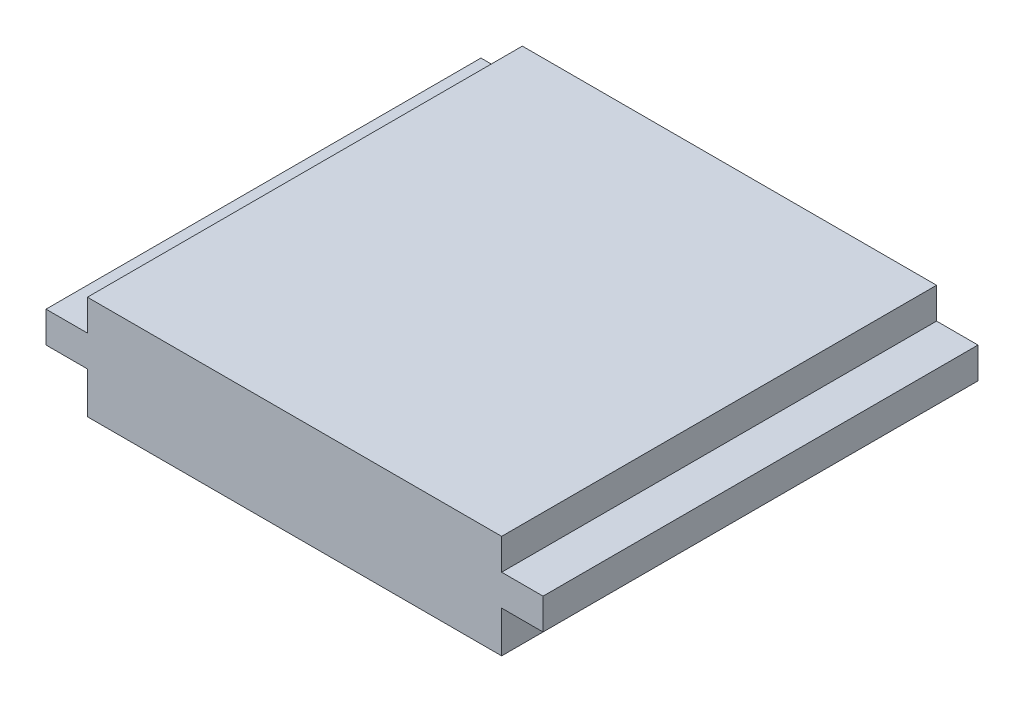
ISO-10303-21;
HEADER;
FILE_DESCRIPTION(('STEP AP214'),'2;1');
FILE_NAME('part.step','',(''),(''),'','','');
FILE_SCHEMA(('AUTOMOTIVE_DESIGN { 1 0 10303 214 1 1 1 1 }'));
ENDSEC;
DATA;
#1=APPLICATION_CONTEXT('core data for automotive mechanical design processes');
#2=APPLICATION_PROTOCOL_DEFINITION('international standard','automotive_design',2000,#1);
#3=PRODUCT_CONTEXT('',#1,'mechanical');
#4=PRODUCT('Part','Part','',(#3));
#5=PRODUCT_RELATED_PRODUCT_CATEGORY('part','',(#4));
#6=PRODUCT_DEFINITION_FORMATION('','',#4);
#7=PRODUCT_DEFINITION_CONTEXT('part definition',#1,'design');
#8=PRODUCT_DEFINITION('design','',#6,#7);
#9=PRODUCT_DEFINITION_SHAPE('','',#8);
#10=(LENGTH_UNIT() NAMED_UNIT(*) SI_UNIT(.MILLI.,.METRE.));
#11=(NAMED_UNIT(*) PLANE_ANGLE_UNIT() SI_UNIT($,.RADIAN.));
#12=(NAMED_UNIT(*) SI_UNIT($,.STERADIAN.) SOLID_ANGLE_UNIT());
#13=UNCERTAINTY_MEASURE_WITH_UNIT(LENGTH_MEASURE(1.E-05),#10,'distance_accuracy_value','');
#14=(GEOMETRIC_REPRESENTATION_CONTEXT(3) GLOBAL_UNCERTAINTY_ASSIGNED_CONTEXT((#13)) GLOBAL_UNIT_ASSIGNED_CONTEXT((#10,
#11,#12)) REPRESENTATION_CONTEXT('',''));
#15=CARTESIAN_POINT('',(0.,0.,0.));
#16=DIRECTION('',(0.,0.,1.));
#17=DIRECTION('',(1.,0.,0.));
#18=AXIS2_PLACEMENT_3D('',#15,#16,#17);
#19=CARTESIAN_POINT('',(0.,2.,21.));
#20=DIRECTION('',(1.,0.,0.));
#21=DIRECTION('',(0.,1.,0.));
#22=AXIS2_PLACEMENT_3D('',#19,#20,#21);
#23=PLANE('',#22);
#24=DIRECTION('',(0.,-1.,0.));
#25=VECTOR('',#24,1.);
#26=CARTESIAN_POINT('',(0.,2.,0.));
#27=LINE('',#26,#25);
#28=CARTESIAN_POINT('',(0.,2.,0.));
#29=VERTEX_POINT('',#28);
#30=CARTESIAN_POINT('',(0.,0.,0.));
#31=VERTEX_POINT('',#30);
#32=EDGE_CURVE('E156',#29,#31,#27,.T.);
#33=ORIENTED_EDGE('',*,*,#32,.T.);
#34=DIRECTION('',(0.,0.,-1.));
#35=VECTOR('',#34,1.);
#36=CARTESIAN_POINT('',(0.,0.,21.));
#37=LINE('',#36,#35);
#38=CARTESIAN_POINT('',(0.,0.,21.));
#39=VERTEX_POINT('',#38);
#40=EDGE_CURVE('E11',#39,#31,#37,.T.);
#41=ORIENTED_EDGE('',*,*,#40,.F.);
#42=DIRECTION('',(0.,-1.,0.));
#43=VECTOR('',#42,1.);
#44=CARTESIAN_POINT('',(0.,2.,21.));
#45=LINE('',#44,#43);
#46=CARTESIAN_POINT('',(0.,2.,21.));
#47=VERTEX_POINT('',#46);
#48=EDGE_CURVE('E178',#47,#39,#45,.T.);
#49=ORIENTED_EDGE('',*,*,#48,.F.);
#50=DIRECTION('',(0.,0.,-1.));
#51=VECTOR('',#50,1.);
#52=CARTESIAN_POINT('',(0.,2.,21.));
#53=LINE('',#52,#51);
#54=EDGE_CURVE('E152',#47,#29,#53,.T.);
#55=ORIENTED_EDGE('',*,*,#54,.T.);
#56=EDGE_LOOP('',(#33,#41,#49,#55));
#57=FACE_BOUND('',#56,.T.);
#58=ADVANCED_FACE('F36',(#57),#23,.F.);
#59=CARTESIAN_POINT('',(0.,0.,21.));
#60=DIRECTION('',(0.,1.,0.));
#61=DIRECTION('',(0.,0.,1.));
#62=AXIS2_PLACEMENT_3D('',#59,#60,#61);
#63=PLANE('',#62);
#64=DIRECTION('',(1.,0.,0.));
#65=VECTOR('',#64,1.);
#66=CARTESIAN_POINT('',(0.,0.,0.));
#67=LINE('',#66,#65);
#68=CARTESIAN_POINT('',(20.,0.,0.));
#69=VERTEX_POINT('',#68);
#70=EDGE_CURVE('E159',#31,#69,#67,.T.);
#71=ORIENTED_EDGE('',*,*,#70,.T.);
#72=DIRECTION('',(0.,0.,-1.));
#73=VECTOR('',#72,1.);
#74=CARTESIAN_POINT('',(20.,0.,21.));
#75=LINE('',#74,#73);
#76=CARTESIAN_POINT('',(20.,0.,21.));
#77=VERTEX_POINT('',#76);
#78=EDGE_CURVE('E44',#77,#69,#75,.T.);
#79=ORIENTED_EDGE('',*,*,#78,.F.);
#80=DIRECTION('',(1.,0.,0.));
#81=VECTOR('',#80,1.);
#82=CARTESIAN_POINT('',(0.,0.,21.));
#83=LINE('',#82,#81);
#84=EDGE_CURVE('E107',#39,#77,#83,.T.);
#85=ORIENTED_EDGE('',*,*,#84,.F.);
#86=ORIENTED_EDGE('',*,*,#40,.T.);
#87=EDGE_LOOP('',(#71,#79,#85,#86));
#88=FACE_BOUND('',#87,.T.);
#89=ADVANCED_FACE('F256',(#88),#63,.F.);
#90=CARTESIAN_POINT('',(20.,0.,21.));
#91=DIRECTION('',(-1.,0.,0.));
#92=DIRECTION('',(0.,0.,1.));
#93=AXIS2_PLACEMENT_3D('',#90,#91,#92);
#94=PLANE('',#93);
#95=DIRECTION('',(0.,1.,0.));
#96=VECTOR('',#95,1.);
#97=CARTESIAN_POINT('',(20.,0.,0.));
#98=LINE('',#97,#96);
#99=CARTESIAN_POINT('',(20.,2.,0.));
#100=VERTEX_POINT('',#99);
#101=EDGE_CURVE('E161',#69,#100,#98,.T.);
#102=ORIENTED_EDGE('',*,*,#101,.T.);
#103=DIRECTION('',(0.,0.,-1.));
#104=VECTOR('',#103,1.);
#105=CARTESIAN_POINT('',(20.,2.,21.));
#106=LINE('',#105,#104);
#107=CARTESIAN_POINT('',(20.,2.,21.));
#108=VERTEX_POINT('',#107);
#109=EDGE_CURVE('E197',#108,#100,#106,.T.);
#110=ORIENTED_EDGE('',*,*,#109,.F.);
#111=DIRECTION('',(0.,1.,0.));
#112=VECTOR('',#111,1.);
#113=CARTESIAN_POINT('',(20.,0.,21.));
#114=LINE('',#113,#112);
#115=EDGE_CURVE('E205',#77,#108,#114,.T.);
#116=ORIENTED_EDGE('',*,*,#115,.F.);
#117=ORIENTED_EDGE('',*,*,#78,.T.);
#118=EDGE_LOOP('',(#102,#110,#116,#117));
#119=FACE_BOUND('',#118,.T.);
#120=ADVANCED_FACE('F203',(#119),#94,.F.);
#121=CARTESIAN_POINT('',(20.,2.,21.));
#122=DIRECTION('',(0.,1.,0.));
#123=DIRECTION('',(0.,0.,1.));
#124=AXIS2_PLACEMENT_3D('',#121,#122,#123);
#125=PLANE('',#124);
#126=DIRECTION('',(1.,0.,0.));
#127=VECTOR('',#126,1.);
#128=CARTESIAN_POINT('',(20.,2.,0.));
#129=LINE('',#128,#127);
#130=CARTESIAN_POINT('',(22.,2.,0.));
#131=VERTEX_POINT('',#130);
#132=EDGE_CURVE('E163',#100,#131,#129,.T.);
#133=ORIENTED_EDGE('',*,*,#132,.T.);
#134=DIRECTION('',(0.,0.,-1.));
#135=VECTOR('',#134,1.);
#136=CARTESIAN_POINT('',(22.,2.,21.));
#137=LINE('',#136,#135);
#138=CARTESIAN_POINT('',(22.,2.,21.));
#139=VERTEX_POINT('',#138);
#140=EDGE_CURVE('E194',#139,#131,#137,.T.);
#141=ORIENTED_EDGE('',*,*,#140,.F.);
#142=DIRECTION('',(1.,0.,0.));
#143=VECTOR('',#142,1.);
#144=CARTESIAN_POINT('',(20.,2.,21.));
#145=LINE('',#144,#143);
#146=EDGE_CURVE('E223',#108,#139,#145,.T.);
#147=ORIENTED_EDGE('',*,*,#146,.F.);
#148=ORIENTED_EDGE('',*,*,#109,.T.);
#149=EDGE_LOOP('',(#133,#141,#147,#148));
#150=FACE_BOUND('',#149,.T.);
#151=ADVANCED_FACE('F214',(#150),#125,.F.);
#152=CARTESIAN_POINT('',(22.,2.,21.));
#153=DIRECTION('',(-1.,0.,0.));
#154=DIRECTION('',(0.,0.,1.));
#155=AXIS2_PLACEMENT_3D('',#152,#153,#154);
#156=PLANE('',#155);
#157=DIRECTION('',(0.,1.,0.));
#158=VECTOR('',#157,1.);
#159=CARTESIAN_POINT('',(22.,2.,0.));
#160=LINE('',#159,#158);
#161=CARTESIAN_POINT('',(22.,3.5,0.));
#162=VERTEX_POINT('',#161);
#163=EDGE_CURVE('E165',#131,#162,#160,.T.);
#164=ORIENTED_EDGE('',*,*,#163,.T.);
#165=DIRECTION('',(0.,0.,-1.));
#166=VECTOR('',#165,1.);
#167=CARTESIAN_POINT('',(22.,3.5,21.));
#168=LINE('',#167,#166);
#169=CARTESIAN_POINT('',(22.,3.5,21.));
#170=VERTEX_POINT('',#169);
#171=EDGE_CURVE('E191',#170,#162,#168,.T.);
#172=ORIENTED_EDGE('',*,*,#171,.F.);
#173=DIRECTION('',(0.,1.,0.));
#174=VECTOR('',#173,1.);
#175=CARTESIAN_POINT('',(22.,2.,21.));
#176=LINE('',#175,#174);
#177=EDGE_CURVE('E220',#139,#170,#176,.T.);
#178=ORIENTED_EDGE('',*,*,#177,.F.);
#179=ORIENTED_EDGE('',*,*,#140,.T.);
#180=EDGE_LOOP('',(#164,#172,#178,#179));
#181=FACE_BOUND('',#180,.T.);
#182=ADVANCED_FACE('F218',(#181),#156,.F.);
#183=CARTESIAN_POINT('',(22.,3.5,21.));
#184=DIRECTION('',(0.,-1.,0.));
#185=DIRECTION('',(1.,0.,0.));
#186=AXIS2_PLACEMENT_3D('',#183,#184,#185);
#187=PLANE('',#186);
#188=DIRECTION('',(-1.,0.,0.));
#189=VECTOR('',#188,1.);
#190=CARTESIAN_POINT('',(22.,3.5,0.));
#191=LINE('',#190,#189);
#192=CARTESIAN_POINT('',(20.,3.5,0.));
#193=VERTEX_POINT('',#192);
#194=EDGE_CURVE('E167',#162,#193,#191,.T.);
#195=ORIENTED_EDGE('',*,*,#194,.T.);
#196=DIRECTION('',(0.,0.,-1.));
#197=VECTOR('',#196,1.);
#198=CARTESIAN_POINT('',(20.,3.5,21.));
#199=LINE('',#198,#197);
#200=CARTESIAN_POINT('',(20.,3.5,21.));
#201=VERTEX_POINT('',#200);
#202=EDGE_CURVE('E188',#201,#193,#199,.T.);
#203=ORIENTED_EDGE('',*,*,#202,.F.);
#204=DIRECTION('',(-1.,0.,0.));
#205=VECTOR('',#204,1.);
#206=CARTESIAN_POINT('',(22.,3.5,21.));
#207=LINE('',#206,#205);
#208=EDGE_CURVE('E222',#170,#201,#207,.T.);
#209=ORIENTED_EDGE('',*,*,#208,.F.);
#210=ORIENTED_EDGE('',*,*,#171,.T.);
#211=EDGE_LOOP('',(#195,#203,#209,#210));
#212=FACE_BOUND('',#211,.T.);
#213=ADVANCED_FACE('F269',(#212),#187,.F.);
#214=CARTESIAN_POINT('',(20.,3.5,21.));
#215=DIRECTION('',(-1.,0.,0.));
#216=DIRECTION('',(0.,0.,1.));
#217=AXIS2_PLACEMENT_3D('',#214,#215,#216);
#218=PLANE('',#217);
#219=DIRECTION('',(0.,1.,0.));
#220=VECTOR('',#219,1.);
#221=CARTESIAN_POINT('',(20.,3.5,0.));
#222=LINE('',#221,#220);
#223=CARTESIAN_POINT('',(20.,5.,0.));
#224=VERTEX_POINT('',#223);
#225=EDGE_CURVE('E169',#193,#224,#222,.T.);
#226=ORIENTED_EDGE('',*,*,#225,.T.);
#227=DIRECTION('',(0.,0.,-1.));
#228=VECTOR('',#227,1.);
#229=CARTESIAN_POINT('',(20.,5.,21.));
#230=LINE('',#229,#228);
#231=CARTESIAN_POINT('',(20.,5.,21.));
#232=VERTEX_POINT('',#231);
#233=EDGE_CURVE('E185',#232,#224,#230,.T.);
#234=ORIENTED_EDGE('',*,*,#233,.F.);
#235=DIRECTION('',(0.,1.,0.));
#236=VECTOR('',#235,1.);
#237=CARTESIAN_POINT('',(20.,3.5,21.));
#238=LINE('',#237,#236);
#239=EDGE_CURVE('E225',#201,#232,#238,.T.);
#240=ORIENTED_EDGE('',*,*,#239,.F.);
#241=ORIENTED_EDGE('',*,*,#202,.T.);
#242=EDGE_LOOP('',(#226,#234,#240,#241));
#243=FACE_BOUND('',#242,.T.);
#244=ADVANCED_FACE('F272',(#243),#218,.F.);
#245=CARTESIAN_POINT('',(20.,5.,21.));
#246=DIRECTION('',(0.,-1.,0.));
#247=DIRECTION('',(1.,0.,0.));
#248=AXIS2_PLACEMENT_3D('',#245,#246,#247);
#249=PLANE('',#248);
#250=DIRECTION('',(-1.,0.,0.));
#251=VECTOR('',#250,1.);
#252=CARTESIAN_POINT('',(20.,5.,0.));
#253=LINE('',#252,#251);
#254=CARTESIAN_POINT('',(0.,5.,0.));
#255=VERTEX_POINT('',#254);
#256=EDGE_CURVE('E171',#224,#255,#253,.T.);
#257=ORIENTED_EDGE('',*,*,#256,.T.);
#258=DIRECTION('',(0.,0.,-1.));
#259=VECTOR('',#258,1.);
#260=CARTESIAN_POINT('',(0.,5.,21.));
#261=LINE('',#260,#259);
#262=CARTESIAN_POINT('',(0.,5.,21.));
#263=VERTEX_POINT('',#262);
#264=EDGE_CURVE('E182',#263,#255,#261,.T.);
#265=ORIENTED_EDGE('',*,*,#264,.F.);
#266=DIRECTION('',(-1.,0.,0.));
#267=VECTOR('',#266,1.);
#268=CARTESIAN_POINT('',(20.,5.,21.));
#269=LINE('',#268,#267);
#270=EDGE_CURVE('E231',#232,#263,#269,.T.);
#271=ORIENTED_EDGE('',*,*,#270,.F.);
#272=ORIENTED_EDGE('',*,*,#233,.T.);
#273=EDGE_LOOP('',(#257,#265,#271,#272));
#274=FACE_BOUND('',#273,.T.);
#275=ADVANCED_FACE('F237',(#274),#249,.F.);
#276=CARTESIAN_POINT('',(0.,5.,21.));
#277=DIRECTION('',(1.,0.,0.));
#278=DIRECTION('',(0.,1.,0.));
#279=AXIS2_PLACEMENT_3D('',#276,#277,#278);
#280=PLANE('',#279);
#281=DIRECTION('',(0.,-1.,0.));
#282=VECTOR('',#281,1.);
#283=CARTESIAN_POINT('',(0.,5.,0.));
#284=LINE('',#283,#282);
#285=CARTESIAN_POINT('',(0.,3.5,0.));
#286=VERTEX_POINT('',#285);
#287=EDGE_CURVE('E173',#255,#286,#284,.T.);
#288=ORIENTED_EDGE('',*,*,#287,.T.);
#289=DIRECTION('',(0.,0.,-1.));
#290=VECTOR('',#289,1.);
#291=CARTESIAN_POINT('',(0.,3.5,21.));
#292=LINE('',#291,#290);
#293=CARTESIAN_POINT('',(0.,3.5,21.));
#294=VERTEX_POINT('',#293);
#295=EDGE_CURVE('E147',#294,#286,#292,.T.);
#296=ORIENTED_EDGE('',*,*,#295,.F.);
#297=DIRECTION('',(0.,-1.,0.));
#298=VECTOR('',#297,1.);
#299=CARTESIAN_POINT('',(0.,5.,21.));
#300=LINE('',#299,#298);
#301=EDGE_CURVE('E138',#263,#294,#300,.T.);
#302=ORIENTED_EDGE('',*,*,#301,.F.);
#303=ORIENTED_EDGE('',*,*,#264,.T.);
#304=EDGE_LOOP('',(#288,#296,#302,#303));
#305=FACE_BOUND('',#304,.T.);
#306=ADVANCED_FACE('F241',(#305),#280,.F.);
#307=CARTESIAN_POINT('',(0.,3.5,21.));
#308=DIRECTION('',(0.,-1.,0.));
#309=DIRECTION('',(1.,0.,0.));
#310=AXIS2_PLACEMENT_3D('',#307,#308,#309);
#311=PLANE('',#310);
#312=DIRECTION('',(-1.,0.,0.));
#313=VECTOR('',#312,1.);
#314=CARTESIAN_POINT('',(0.,3.5,0.));
#315=LINE('',#314,#313);
#316=CARTESIAN_POINT('',(-2.,3.5,0.));
#317=VERTEX_POINT('',#316);
#318=EDGE_CURVE('E146',#286,#317,#315,.T.);
#319=ORIENTED_EDGE('',*,*,#318,.T.);
#320=DIRECTION('',(0.,0.,-1.));
#321=VECTOR('',#320,1.);
#322=CARTESIAN_POINT('',(-2.,3.5,21.));
#323=LINE('',#322,#321);
#324=CARTESIAN_POINT('',(-2.,3.5,21.));
#325=VERTEX_POINT('',#324);
#326=EDGE_CURVE('E143',#325,#317,#323,.T.);
#327=ORIENTED_EDGE('',*,*,#326,.F.);
#328=DIRECTION('',(-1.,0.,0.));
#329=VECTOR('',#328,1.);
#330=CARTESIAN_POINT('',(0.,3.5,21.));
#331=LINE('',#330,#329);
#332=EDGE_CURVE('E132',#294,#325,#331,.T.);
#333=ORIENTED_EDGE('',*,*,#332,.F.);
#334=ORIENTED_EDGE('',*,*,#295,.T.);
#335=EDGE_LOOP('',(#319,#327,#333,#334));
#336=FACE_BOUND('',#335,.T.);
#337=ADVANCED_FACE('F144',(#336),#311,.F.);
#338=CARTESIAN_POINT('',(-2.,3.5,21.));
#339=DIRECTION('',(1.,0.,0.));
#340=DIRECTION('',(0.,0.,-1.));
#341=AXIS2_PLACEMENT_3D('',#338,#339,#340);
#342=PLANE('',#341);
#343=DIRECTION('',(0.,-1.,0.));
#344=VECTOR('',#343,1.);
#345=CARTESIAN_POINT('',(-2.,3.5,0.));
#346=LINE('',#345,#344);
#347=CARTESIAN_POINT('',(-2.,2.,0.));
#348=VERTEX_POINT('',#347);
#349=EDGE_CURVE('E93',#317,#348,#346,.T.);
#350=ORIENTED_EDGE('',*,*,#349,.T.);
#351=DIRECTION('',(0.,0.,-1.));
#352=VECTOR('',#351,1.);
#353=CARTESIAN_POINT('',(-2.,2.,21.));
#354=LINE('',#353,#352);
#355=CARTESIAN_POINT('',(-2.,2.,21.));
#356=VERTEX_POINT('',#355);
#357=EDGE_CURVE('E148',#356,#348,#354,.T.);
#358=ORIENTED_EDGE('',*,*,#357,.F.);
#359=DIRECTION('',(0.,-1.,0.));
#360=VECTOR('',#359,1.);
#361=CARTESIAN_POINT('',(-2.,3.5,21.));
#362=LINE('',#361,#360);
#363=EDGE_CURVE('E136',#325,#356,#362,.T.);
#364=ORIENTED_EDGE('',*,*,#363,.F.);
#365=ORIENTED_EDGE('',*,*,#326,.T.);
#366=EDGE_LOOP('',(#350,#358,#364,#365));
#367=FACE_BOUND('',#366,.T.);
#368=ADVANCED_FACE('F150',(#367),#342,.F.);
#369=CARTESIAN_POINT('',(-2.,2.,21.));
#370=DIRECTION('',(0.,1.,0.));
#371=DIRECTION('',(-1.,0.,0.));
#372=AXIS2_PLACEMENT_3D('',#369,#370,#371);
#373=PLANE('',#372);
#374=DIRECTION('',(1.,0.,0.));
#375=VECTOR('',#374,1.);
#376=CARTESIAN_POINT('',(-2.,2.,0.));
#377=LINE('',#376,#375);
#378=EDGE_CURVE('E99',#348,#29,#377,.T.);
#379=ORIENTED_EDGE('',*,*,#378,.T.);
#380=ORIENTED_EDGE('',*,*,#54,.F.);
#381=DIRECTION('',(1.,0.,0.));
#382=VECTOR('',#381,1.);
#383=CARTESIAN_POINT('',(-2.,2.,21.));
#384=LINE('',#383,#382);
#385=EDGE_CURVE('E52',#356,#47,#384,.T.);
#386=ORIENTED_EDGE('',*,*,#385,.F.);
#387=ORIENTED_EDGE('',*,*,#357,.T.);
#388=EDGE_LOOP('',(#379,#380,#386,#387));
#389=FACE_BOUND('',#388,.T.);
#390=ADVANCED_FACE('F245',(#389),#373,.F.);
#391=CARTESIAN_POINT('',(0.,0.,21.));
#392=DIRECTION('',(0.,0.,1.));
#393=DIRECTION('',(1.,0.,0.));
#394=AXIS2_PLACEMENT_3D('',#391,#392,#393);
#395=PLANE('',#394);
#396=ORIENTED_EDGE('',*,*,#48,.T.);
#397=ORIENTED_EDGE('',*,*,#84,.T.);
#398=ORIENTED_EDGE('',*,*,#115,.T.);
#399=ORIENTED_EDGE('',*,*,#146,.T.);
#400=ORIENTED_EDGE('',*,*,#177,.T.);
#401=ORIENTED_EDGE('',*,*,#208,.T.);
#402=ORIENTED_EDGE('',*,*,#239,.T.);
#403=ORIENTED_EDGE('',*,*,#270,.T.);
#404=ORIENTED_EDGE('',*,*,#301,.T.);
#405=ORIENTED_EDGE('',*,*,#332,.T.);
#406=ORIENTED_EDGE('',*,*,#363,.T.);
#407=ORIENTED_EDGE('',*,*,#385,.T.);
#408=EDGE_LOOP('',(#396,#397,#398,#399,#400,#401,#402,#403,#404,#405,#406,#407));
#409=FACE_BOUND('',#408,.T.);
#410=ADVANCED_FACE('F134',(#409),#395,.T.);
#411=CARTESIAN_POINT('',(0.,0.,0.));
#412=DIRECTION('',(0.,0.,1.));
#413=DIRECTION('',(1.,0.,0.));
#414=AXIS2_PLACEMENT_3D('',#411,#412,#413);
#415=PLANE('',#414);
#416=ORIENTED_EDGE('',*,*,#32,.F.);
#417=ORIENTED_EDGE('',*,*,#378,.F.);
#418=ORIENTED_EDGE('',*,*,#349,.F.);
#419=ORIENTED_EDGE('',*,*,#318,.F.);
#420=ORIENTED_EDGE('',*,*,#287,.F.);
#421=ORIENTED_EDGE('',*,*,#256,.F.);
#422=ORIENTED_EDGE('',*,*,#225,.F.);
#423=ORIENTED_EDGE('',*,*,#194,.F.);
#424=ORIENTED_EDGE('',*,*,#163,.F.);
#425=ORIENTED_EDGE('',*,*,#132,.F.);
#426=ORIENTED_EDGE('',*,*,#101,.F.);
#427=ORIENTED_EDGE('',*,*,#70,.F.);
#428=EDGE_LOOP('',(#416,#417,#418,#419,#420,#421,#422,#423,#424,#425,#426,#427));
#429=FACE_BOUND('',#428,.T.);
#430=ADVANCED_FACE('F209',(#429),#415,.F.);
#431=CLOSED_SHELL('',(#58,#89,#120,#151,#182,#213,#244,#275,#306,#337,#368,#390,#410,#430));
#432=MANIFOLD_SOLID_BREP('B2',#431);
#433=ADVANCED_BREP_SHAPE_REPRESENTATION('',(#18,#432),#14);
#434=SHAPE_DEFINITION_REPRESENTATION(#9,#433);
ENDSEC;
END-ISO-10303-21;
